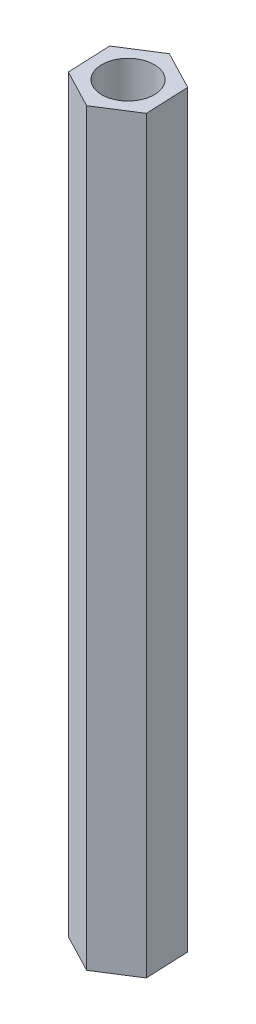
ISO-10303-21;
HEADER;
FILE_DESCRIPTION(('STEP AP214'),'2;1');
FILE_NAME('part.step','',(''),(''),'','','');
FILE_SCHEMA(('AUTOMOTIVE_DESIGN { 1 0 10303 214 1 1 1 1 }'));
ENDSEC;
DATA;
#1=APPLICATION_CONTEXT('core data for automotive mechanical design processes');
#2=APPLICATION_PROTOCOL_DEFINITION('international standard','automotive_design',2000,#1);
#3=PRODUCT_CONTEXT('',#1,'mechanical');
#4=PRODUCT('Part','Part','',(#3));
#5=PRODUCT_RELATED_PRODUCT_CATEGORY('part','',(#4));
#6=PRODUCT_DEFINITION_FORMATION('','',#4);
#7=PRODUCT_DEFINITION_CONTEXT('part definition',#1,'design');
#8=PRODUCT_DEFINITION('design','',#6,#7);
#9=PRODUCT_DEFINITION_SHAPE('','',#8);
#10=(LENGTH_UNIT() NAMED_UNIT(*) SI_UNIT(.MILLI.,.METRE.));
#11=(NAMED_UNIT(*) PLANE_ANGLE_UNIT() SI_UNIT($,.RADIAN.));
#12=(NAMED_UNIT(*) SI_UNIT($,.STERADIAN.) SOLID_ANGLE_UNIT());
#13=UNCERTAINTY_MEASURE_WITH_UNIT(LENGTH_MEASURE(1.E-05),#10,'distance_accuracy_value','');
#14=(GEOMETRIC_REPRESENTATION_CONTEXT(3) GLOBAL_UNCERTAINTY_ASSIGNED_CONTEXT((#13)) GLOBAL_UNIT_ASSIGNED_CONTEXT((#10,
#11,#12)) REPRESENTATION_CONTEXT('',''));
#15=CARTESIAN_POINT('',(0.,0.,0.));
#16=DIRECTION('',(0.,0.,1.));
#17=DIRECTION('',(1.,0.,0.));
#18=AXIS2_PLACEMENT_3D('',#15,#16,#17);
#19=CARTESIAN_POINT('',(0.,60.,0.));
#20=DIRECTION('',(0.,1.,0.));
#21=DIRECTION('',(0.,0.,1.));
#22=AXIS2_PLACEMENT_3D('',#19,#20,#21);
#23=PLANE('',#22);
#24=DIRECTION('',(0.844060336161906,0.,-0.536248215771624));
#25=VECTOR('',#24,1.);
#26=CARTESIAN_POINT('',(0.146789260428784,60.,3.46099016367034));
#27=LINE('',#26,#25);
#28=CARTESIAN_POINT('',(0.146789260428784,60.,3.46099016367034));
#29=VERTEX_POINT('',#28);
#30=CARTESIAN_POINT('',(3.07070003420097,60.,1.60337185330111));
#31=VERTEX_POINT('',#30);
#32=EDGE_CURVE('E137',#29,#31,#27,.T.);
#33=ORIENTED_EDGE('',*,*,#32,.T.);
#34=DIRECTION('',(-0.0423744095113541,0.,-0.999101801328856));
#35=VECTOR('',#34,1.);
#36=CARTESIAN_POINT('',(3.07070003420097,60.,1.60337185330111));
#37=LINE('',#36,#35);
#38=CARTESIAN_POINT('',(2.92391077377218,60.,-1.85761831036924));
#39=VERTEX_POINT('',#38);
#40=EDGE_CURVE('E95',#31,#39,#37,.T.);
#41=ORIENTED_EDGE('',*,*,#40,.T.);
#42=DIRECTION('',(-0.886434745673259,0.,-0.46285358555723));
#43=VECTOR('',#42,1.);
#44=CARTESIAN_POINT('',(2.92391077377218,60.,-1.85761831036924));
#45=LINE('',#44,#43);
#46=CARTESIAN_POINT('',(-0.146789260428791,60.,-3.46099016367034));
#47=VERTEX_POINT('',#46);
#48=EDGE_CURVE('E108',#39,#47,#45,.T.);
#49=ORIENTED_EDGE('',*,*,#48,.T.);
#50=DIRECTION('',(-0.844060336161905,0.,0.536248215771625));
#51=VECTOR('',#50,1.);
#52=CARTESIAN_POINT('',(-0.146789260428791,60.,-3.46099016367034));
#53=LINE('',#52,#51);
#54=CARTESIAN_POINT('',(-3.07070003420097,60.,-1.60337185330111));
#55=VERTEX_POINT('',#54);
#56=EDGE_CURVE('E102',#47,#55,#53,.T.);
#57=ORIENTED_EDGE('',*,*,#56,.T.);
#58=DIRECTION('',(0.042374409511354,0.,0.999101801328856));
#59=VECTOR('',#58,1.);
#60=CARTESIAN_POINT('',(-3.07070003420097,60.,-1.60337185330111));
#61=LINE('',#60,#59);
#62=CARTESIAN_POINT('',(-2.92391077377218,60.,1.85761831036924));
#63=VERTEX_POINT('',#62);
#64=EDGE_CURVE('E106',#55,#63,#61,.T.);
#65=ORIENTED_EDGE('',*,*,#64,.T.);
#66=DIRECTION('',(0.886434745673259,0.,0.462853585557231));
#67=VECTOR('',#66,1.);
#68=CARTESIAN_POINT('',(-2.92391077377218,60.,1.85761831036924));
#69=LINE('',#68,#67);
#70=EDGE_CURVE('E58',#63,#29,#69,.T.);
#71=ORIENTED_EDGE('',*,*,#70,.T.);
#72=EDGE_LOOP('',(#33,#41,#49,#57,#65,#71));
#73=FACE_BOUND('',#72,.T.);
#74=CARTESIAN_POINT('',(0.,60.,0.));
#75=DIRECTION('',(0.,1.,0.));
#76=DIRECTION('',(0.,0.,1.));
#77=AXIS2_PLACEMENT_3D('',#74,#75,#76);
#78=CIRCLE('',#77,2.1);
#79=CARTESIAN_POINT('',(0.,60.,2.1));
#80=VERTEX_POINT('',#79);
#81=EDGE_CURVE('E130',#80,#80,#78,.T.);
#82=ORIENTED_EDGE('',*,*,#81,.F.);
#83=EDGE_LOOP('',(#82));
#84=FACE_BOUND('',#83,.T.);
#85=ADVANCED_FACE('F41',(#73,#84),#23,.T.);
#86=CARTESIAN_POINT('',(0.,0.,0.));
#87=DIRECTION('',(0.,1.,0.));
#88=DIRECTION('',(0.,0.,1.));
#89=AXIS2_PLACEMENT_3D('',#86,#87,#88);
#90=PLANE('',#89);
#91=DIRECTION('',(0.844060336161906,0.,-0.536248215771624));
#92=VECTOR('',#91,1.);
#93=CARTESIAN_POINT('',(0.146789260428784,0.,3.46099016367034));
#94=LINE('',#93,#92);
#95=CARTESIAN_POINT('',(0.146789260428784,0.,3.46099016367034));
#96=VERTEX_POINT('',#95);
#97=CARTESIAN_POINT('',(3.07070003420097,0.,1.60337185330111));
#98=VERTEX_POINT('',#97);
#99=EDGE_CURVE('E126',#96,#98,#94,.T.);
#100=ORIENTED_EDGE('',*,*,#99,.F.);
#101=DIRECTION('',(0.886434745673259,0.,0.462853585557231));
#102=VECTOR('',#101,1.);
#103=CARTESIAN_POINT('',(-2.92391077377218,0.,1.85761831036924));
#104=LINE('',#103,#102);
#105=CARTESIAN_POINT('',(-2.92391077377218,0.,1.85761831036924));
#106=VERTEX_POINT('',#105);
#107=EDGE_CURVE('E87',#106,#96,#104,.T.);
#108=ORIENTED_EDGE('',*,*,#107,.F.);
#109=DIRECTION('',(0.042374409511354,0.,0.999101801328856));
#110=VECTOR('',#109,1.);
#111=CARTESIAN_POINT('',(-3.07070003420097,0.,-1.60337185330111));
#112=LINE('',#111,#110);
#113=CARTESIAN_POINT('',(-3.07070003420097,0.,-1.60337185330111));
#114=VERTEX_POINT('',#113);
#115=EDGE_CURVE('E81',#114,#106,#112,.T.);
#116=ORIENTED_EDGE('',*,*,#115,.F.);
#117=DIRECTION('',(-0.844060336161905,0.,0.536248215771625));
#118=VECTOR('',#117,1.);
#119=CARTESIAN_POINT('',(-0.146789260428791,0.,-3.46099016367034));
#120=LINE('',#119,#118);
#121=CARTESIAN_POINT('',(-0.146789260428791,0.,-3.46099016367034));
#122=VERTEX_POINT('',#121);
#123=EDGE_CURVE('E116',#122,#114,#120,.T.);
#124=ORIENTED_EDGE('',*,*,#123,.F.);
#125=DIRECTION('',(-0.886434745673259,0.,-0.46285358555723));
#126=VECTOR('',#125,1.);
#127=CARTESIAN_POINT('',(2.92391077377218,0.,-1.85761831036924));
#128=LINE('',#127,#126);
#129=CARTESIAN_POINT('',(2.92391077377218,0.,-1.85761831036924));
#130=VERTEX_POINT('',#129);
#131=EDGE_CURVE('E132',#130,#122,#128,.T.);
#132=ORIENTED_EDGE('',*,*,#131,.F.);
#133=DIRECTION('',(-0.0423744095113541,0.,-0.999101801328856));
#134=VECTOR('',#133,1.);
#135=CARTESIAN_POINT('',(3.07070003420097,0.,1.60337185330111));
#136=LINE('',#135,#134);
#137=EDGE_CURVE('E129',#98,#130,#136,.T.);
#138=ORIENTED_EDGE('',*,*,#137,.F.);
#139=EDGE_LOOP('',(#100,#108,#116,#124,#132,#138));
#140=FACE_BOUND('',#139,.T.);
#141=CARTESIAN_POINT('',(0.,0.,0.));
#142=DIRECTION('',(0.,1.,0.));
#143=DIRECTION('',(0.,0.,1.));
#144=AXIS2_PLACEMENT_3D('',#141,#142,#143);
#145=CIRCLE('',#144,2.1);
#146=CARTESIAN_POINT('',(0.,0.,2.1));
#147=VERTEX_POINT('',#146);
#148=EDGE_CURVE('E230',#147,#147,#145,.T.);
#149=ORIENTED_EDGE('',*,*,#148,.T.);
#150=EDGE_LOOP('',(#149));
#151=FACE_BOUND('',#150,.T.);
#152=ADVANCED_FACE('F146',(#140,#151),#90,.F.);
#153=CARTESIAN_POINT('',(0.146789260428784,60.,3.46099016367034));
#154=DIRECTION('',(-0.536248215771624,0.,-0.844060336161906));
#155=DIRECTION('',(-0.844060336161906,0.,0.536248215771624));
#156=AXIS2_PLACEMENT_3D('',#153,#154,#155);
#157=PLANE('',#156);
#158=ORIENTED_EDGE('',*,*,#99,.T.);
#159=DIRECTION('',(0.,-1.,0.));
#160=VECTOR('',#159,1.);
#161=CARTESIAN_POINT('',(3.07070003420097,60.,1.60337185330111));
#162=LINE('',#161,#160);
#163=EDGE_CURVE('E11',#31,#98,#162,.T.);
#164=ORIENTED_EDGE('',*,*,#163,.F.);
#165=ORIENTED_EDGE('',*,*,#32,.F.);
#166=DIRECTION('',(0.,-1.,0.));
#167=VECTOR('',#166,1.);
#168=CARTESIAN_POINT('',(0.146789260428784,60.,3.46099016367034));
#169=LINE('',#168,#167);
#170=EDGE_CURVE('E122',#29,#96,#169,.T.);
#171=ORIENTED_EDGE('',*,*,#170,.T.);
#172=EDGE_LOOP('',(#158,#164,#165,#171));
#173=FACE_BOUND('',#172,.T.);
#174=ADVANCED_FACE('F43',(#173),#157,.F.);
#175=CARTESIAN_POINT('',(3.07070003420097,60.,1.60337185330111));
#176=DIRECTION('',(-0.999101801328856,0.,0.0423744095113541));
#177=DIRECTION('',(0.0423744095113541,0.,0.999101801328856));
#178=AXIS2_PLACEMENT_3D('',#175,#176,#177);
#179=PLANE('',#178);
#180=ORIENTED_EDGE('',*,*,#137,.T.);
#181=DIRECTION('',(0.,-1.,0.));
#182=VECTOR('',#181,1.);
#183=CARTESIAN_POINT('',(2.92391077377218,60.,-1.85761831036924));
#184=LINE('',#183,#182);
#185=EDGE_CURVE('E50',#39,#130,#184,.T.);
#186=ORIENTED_EDGE('',*,*,#185,.F.);
#187=ORIENTED_EDGE('',*,*,#40,.F.);
#188=ORIENTED_EDGE('',*,*,#163,.T.);
#189=EDGE_LOOP('',(#180,#186,#187,#188));
#190=FACE_BOUND('',#189,.T.);
#191=ADVANCED_FACE('F171',(#190),#179,.F.);
#192=CARTESIAN_POINT('',(2.92391077377218,60.,-1.85761831036924));
#193=DIRECTION('',(-0.46285358555723,0.,0.886434745673259));
#194=DIRECTION('',(0.886434745673259,0.,0.46285358555723));
#195=AXIS2_PLACEMENT_3D('',#192,#193,#194);
#196=PLANE('',#195);
#197=ORIENTED_EDGE('',*,*,#131,.T.);
#198=DIRECTION('',(0.,-1.,0.));
#199=VECTOR('',#198,1.);
#200=CARTESIAN_POINT('',(-0.146789260428791,60.,-3.46099016367034));
#201=LINE('',#200,#199);
#202=EDGE_CURVE('E117',#47,#122,#201,.T.);
#203=ORIENTED_EDGE('',*,*,#202,.F.);
#204=ORIENTED_EDGE('',*,*,#48,.F.);
#205=ORIENTED_EDGE('',*,*,#185,.T.);
#206=EDGE_LOOP('',(#197,#203,#204,#205));
#207=FACE_BOUND('',#206,.T.);
#208=ADVANCED_FACE('F143',(#207),#196,.F.);
#209=CARTESIAN_POINT('',(-0.146789260428791,60.,-3.46099016367034));
#210=DIRECTION('',(0.536248215771625,0.,0.844060336161905));
#211=DIRECTION('',(0.844060336161905,0.,-0.536248215771625));
#212=AXIS2_PLACEMENT_3D('',#209,#210,#211);
#213=PLANE('',#212);
#214=ORIENTED_EDGE('',*,*,#123,.T.);
#215=DIRECTION('',(0.,-1.,0.));
#216=VECTOR('',#215,1.);
#217=CARTESIAN_POINT('',(-3.07070003420097,60.,-1.60337185330111));
#218=LINE('',#217,#216);
#219=EDGE_CURVE('E113',#55,#114,#218,.T.);
#220=ORIENTED_EDGE('',*,*,#219,.F.);
#221=ORIENTED_EDGE('',*,*,#56,.F.);
#222=ORIENTED_EDGE('',*,*,#202,.T.);
#223=EDGE_LOOP('',(#214,#220,#221,#222));
#224=FACE_BOUND('',#223,.T.);
#225=ADVANCED_FACE('F114',(#224),#213,.F.);
#226=CARTESIAN_POINT('',(-3.07070003420097,60.,-1.60337185330111));
#227=DIRECTION('',(0.999101801328856,0.,-0.042374409511354));
#228=DIRECTION('',(-0.042374409511354,0.,-0.999101801328856));
#229=AXIS2_PLACEMENT_3D('',#226,#227,#228);
#230=PLANE('',#229);
#231=ORIENTED_EDGE('',*,*,#115,.T.);
#232=DIRECTION('',(0.,-1.,0.));
#233=VECTOR('',#232,1.);
#234=CARTESIAN_POINT('',(-2.92391077377218,60.,1.85761831036924));
#235=LINE('',#234,#233);
#236=EDGE_CURVE('E118',#63,#106,#235,.T.);
#237=ORIENTED_EDGE('',*,*,#236,.F.);
#238=ORIENTED_EDGE('',*,*,#64,.F.);
#239=ORIENTED_EDGE('',*,*,#219,.T.);
#240=EDGE_LOOP('',(#231,#237,#238,#239));
#241=FACE_BOUND('',#240,.T.);
#242=ADVANCED_FACE('F120',(#241),#230,.F.);
#243=CARTESIAN_POINT('',(-2.92391077377218,60.,1.85761831036924));
#244=DIRECTION('',(0.462853585557231,0.,-0.886434745673259));
#245=DIRECTION('',(-0.886434745673259,0.,-0.462853585557231));
#246=AXIS2_PLACEMENT_3D('',#243,#244,#245);
#247=PLANE('',#246);
#248=ORIENTED_EDGE('',*,*,#107,.T.);
#249=ORIENTED_EDGE('',*,*,#170,.F.);
#250=ORIENTED_EDGE('',*,*,#70,.F.);
#251=ORIENTED_EDGE('',*,*,#236,.T.);
#252=EDGE_LOOP('',(#248,#249,#250,#251));
#253=FACE_BOUND('',#252,.T.);
#254=ADVANCED_FACE('F151',(#253),#247,.F.);
#255=CARTESIAN_POINT('',(0.,60.,0.));
#256=DIRECTION('',(0.,-1.,0.));
#257=DIRECTION('',(0.,0.,-1.));
#258=AXIS2_PLACEMENT_3D('',#255,#256,#257);
#259=CYLINDRICAL_SURFACE('',#258,2.1);
#260=ORIENTED_EDGE('',*,*,#81,.T.);
#261=EDGE_LOOP('',(#260));
#262=FACE_BOUND('',#261,.T.);
#263=ORIENTED_EDGE('',*,*,#148,.F.);
#264=EDGE_LOOP('',(#263));
#265=FACE_BOUND('',#264,.T.);
#266=ADVANCED_FACE('F153',(#262,#265),#259,.F.);
#267=CLOSED_SHELL('',(#85,#152,#174,#191,#208,#225,#242,#254,#266));
#268=MANIFOLD_SOLID_BREP('B2',#267);
#269=ADVANCED_BREP_SHAPE_REPRESENTATION('',(#18,#268),#14);
#270=SHAPE_DEFINITION_REPRESENTATION(#9,#269);
ENDSEC;
END-ISO-10303-21;
